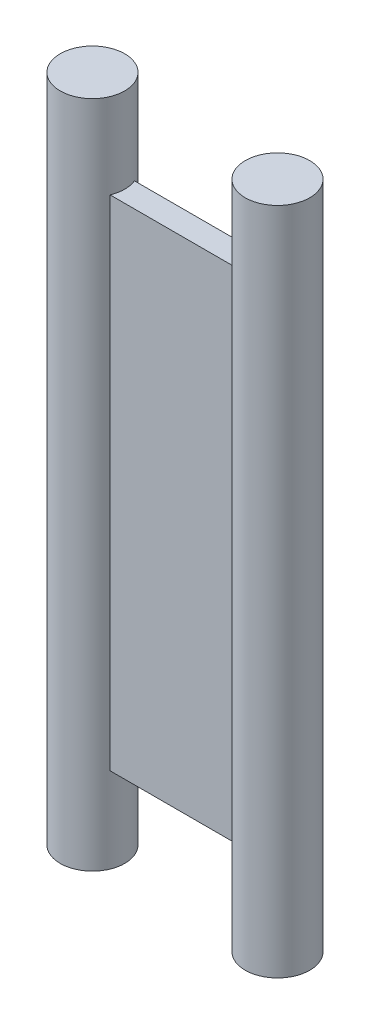
ISO-10303-21;
HEADER;
FILE_DESCRIPTION(('STEP AP214'),'2;1');
FILE_NAME('part.step','',(''),(''),'','','');
FILE_SCHEMA(('AUTOMOTIVE_DESIGN { 1 0 10303 214 1 1 1 1 }'));
ENDSEC;
DATA;
#1=APPLICATION_CONTEXT('core data for automotive mechanical design processes');
#2=APPLICATION_PROTOCOL_DEFINITION('international standard','automotive_design',2000,#1);
#3=PRODUCT_CONTEXT('',#1,'mechanical');
#4=PRODUCT('Part','Part','',(#3));
#5=PRODUCT_RELATED_PRODUCT_CATEGORY('part','',(#4));
#6=PRODUCT_DEFINITION_FORMATION('','',#4);
#7=PRODUCT_DEFINITION_CONTEXT('part definition',#1,'design');
#8=PRODUCT_DEFINITION('design','',#6,#7);
#9=PRODUCT_DEFINITION_SHAPE('','',#8);
#10=(LENGTH_UNIT() NAMED_UNIT(*) SI_UNIT(.MILLI.,.METRE.));
#11=(NAMED_UNIT(*) PLANE_ANGLE_UNIT() SI_UNIT($,.RADIAN.));
#12=(NAMED_UNIT(*) SI_UNIT($,.STERADIAN.) SOLID_ANGLE_UNIT());
#13=UNCERTAINTY_MEASURE_WITH_UNIT(LENGTH_MEASURE(1.E-05),#10,'distance_accuracy_value','');
#14=(GEOMETRIC_REPRESENTATION_CONTEXT(3) GLOBAL_UNCERTAINTY_ASSIGNED_CONTEXT((#13)) GLOBAL_UNIT_ASSIGNED_CONTEXT((#10,
#11,#12)) REPRESENTATION_CONTEXT('',''));
#15=CARTESIAN_POINT('',(0.,0.,0.));
#16=DIRECTION('',(0.,0.,1.));
#17=DIRECTION('',(1.,0.,0.));
#18=AXIS2_PLACEMENT_3D('',#15,#16,#17);
#19=CARTESIAN_POINT('',(3.803,20.5,0.5));
#20=DIRECTION('',(0.,0.,-1.));
#21=DIRECTION('',(-1.,0.,0.));
#22=AXIS2_PLACEMENT_3D('',#19,#20,#21);
#23=PLANE('',#22);
#24=DIRECTION('',(0.,-1.,0.));
#25=VECTOR('',#24,1.);
#26=CARTESIAN_POINT('',(2.5759608808192,24.,0.5));
#27=LINE('',#26,#25);
#28=CARTESIAN_POINT('',(2.5759608808192,20.5,0.5));
#29=VERTEX_POINT('',#28);
#30=CARTESIAN_POINT('',(2.5759608808192,0.,0.499999999999999));
#31=VERTEX_POINT('',#30);
#32=EDGE_CURVE('E53',#29,#31,#27,.T.);
#33=ORIENTED_EDGE('',*,*,#32,.F.);
#34=DIRECTION('',(1.,0.,0.));
#35=VECTOR('',#34,1.);
#36=CARTESIAN_POINT('',(3.803,20.5,0.5));
#37=LINE('',#36,#35);
#38=CARTESIAN_POINT('',(-2.5759608808192,20.5,0.5));
#39=VERTEX_POINT('',#38);
#40=EDGE_CURVE('E90',#39,#29,#37,.T.);
#41=ORIENTED_EDGE('',*,*,#40,.F.);
#42=DIRECTION('',(0.,-1.,0.));
#43=VECTOR('',#42,1.);
#44=CARTESIAN_POINT('',(-2.5759608808192,24.,0.5));
#45=LINE('',#44,#43);
#46=CARTESIAN_POINT('',(-2.5759608808192,0.,0.5));
#47=VERTEX_POINT('',#46);
#48=EDGE_CURVE('E103',#47,#39,#45,.F.);
#49=ORIENTED_EDGE('',*,*,#48,.F.);
#50=DIRECTION('',(1.,0.,0.));
#51=VECTOR('',#50,1.);
#52=CARTESIAN_POINT('',(3.803,0.,0.5));
#53=LINE('',#52,#51);
#54=EDGE_CURVE('E91',#47,#31,#53,.T.);
#55=ORIENTED_EDGE('',*,*,#54,.T.);
#56=EDGE_LOOP('',(#33,#41,#49,#55));
#57=FACE_BOUND('',#56,.T.);
#58=ADVANCED_FACE('F39',(#57),#23,.F.);
#59=CARTESIAN_POINT('',(3.803,20.5,-0.5));
#60=DIRECTION('',(0.,0.,1.));
#61=DIRECTION('',(1.,0.,0.));
#62=AXIS2_PLACEMENT_3D('',#59,#60,#61);
#63=PLANE('',#62);
#64=DIRECTION('',(0.,-1.,0.));
#65=VECTOR('',#64,1.);
#66=CARTESIAN_POINT('',(2.5759608808192,24.,-0.5));
#67=LINE('',#66,#65);
#68=CARTESIAN_POINT('',(2.5759608808192,0.,-0.5));
#69=VERTEX_POINT('',#68);
#70=CARTESIAN_POINT('',(2.5759608808192,20.5,-0.5));
#71=VERTEX_POINT('',#70);
#72=EDGE_CURVE('E78',#69,#71,#67,.F.);
#73=ORIENTED_EDGE('',*,*,#72,.F.);
#74=DIRECTION('',(-1.,0.,0.));
#75=VECTOR('',#74,1.);
#76=CARTESIAN_POINT('',(3.803,0.,-0.5));
#77=LINE('',#76,#75);
#78=CARTESIAN_POINT('',(-2.5759608808192,0.,-0.499999999999999));
#79=VERTEX_POINT('',#78);
#80=EDGE_CURVE('E60',#69,#79,#77,.T.);
#81=ORIENTED_EDGE('',*,*,#80,.T.);
#82=DIRECTION('',(0.,-1.,0.));
#83=VECTOR('',#82,1.);
#84=CARTESIAN_POINT('',(-2.5759608808192,24.,-0.5));
#85=LINE('',#84,#83);
#86=CARTESIAN_POINT('',(-2.5759608808192,20.5,-0.5));
#87=VERTEX_POINT('',#86);
#88=EDGE_CURVE('E105',#87,#79,#85,.T.);
#89=ORIENTED_EDGE('',*,*,#88,.F.);
#90=DIRECTION('',(-1.,0.,0.));
#91=VECTOR('',#90,1.);
#92=CARTESIAN_POINT('',(3.803,20.5,-0.5));
#93=LINE('',#92,#91);
#94=EDGE_CURVE('E85',#71,#87,#93,.T.);
#95=ORIENTED_EDGE('',*,*,#94,.F.);
#96=EDGE_LOOP('',(#73,#81,#89,#95));
#97=FACE_BOUND('',#96,.T.);
#98=ADVANCED_FACE('F84',(#97),#63,.F.);
#99=CARTESIAN_POINT('',(-3.803,24.,0.));
#100=DIRECTION('',(0.,-1.,0.));
#101=DIRECTION('',(0.,0.,-1.));
#102=AXIS2_PLACEMENT_3D('',#99,#100,#101);
#103=CYLINDRICAL_SURFACE('',#102,1.325);
#104=CARTESIAN_POINT('',(-3.803,24.,0.));
#105=DIRECTION('',(0.,1.,0.));
#106=DIRECTION('',(0.,0.,1.));
#107=AXIS2_PLACEMENT_3D('',#104,#105,#106);
#108=CIRCLE('',#107,1.325);
#109=CARTESIAN_POINT('',(-3.803,24.,1.325));
#110=VERTEX_POINT('',#109);
#111=EDGE_CURVE('E107',#110,#110,#108,.T.);
#112=ORIENTED_EDGE('',*,*,#111,.F.);
#113=EDGE_LOOP('',(#112));
#114=FACE_BOUND('',#113,.T.);
#115=CARTESIAN_POINT('',(-3.803,-3.5,0.));
#116=DIRECTION('',(0.,1.,0.));
#117=DIRECTION('',(0.,0.,1.));
#118=AXIS2_PLACEMENT_3D('',#115,#116,#117);
#119=CIRCLE('',#118,1.325);
#120=CARTESIAN_POINT('',(-3.803,-3.5,1.325));
#121=VERTEX_POINT('',#120);
#122=EDGE_CURVE('E108',#121,#121,#119,.T.);
#123=ORIENTED_EDGE('',*,*,#122,.T.);
#124=EDGE_LOOP('',(#123));
#125=FACE_BOUND('',#124,.T.);
#126=ORIENTED_EDGE('',*,*,#48,.T.);
#127=CARTESIAN_POINT('',(-3.803,20.5,0.));
#128=DIRECTION('',(0.,-1.,0.));
#129=DIRECTION('',(0.,0.,-1.));
#130=AXIS2_PLACEMENT_3D('',#127,#128,#129);
#131=CIRCLE('',#130,1.325);
#132=EDGE_CURVE('E95',#39,#87,#131,.F.);
#133=ORIENTED_EDGE('',*,*,#132,.T.);
#134=ORIENTED_EDGE('',*,*,#88,.T.);
#135=CARTESIAN_POINT('',(-3.803,0.,0.));
#136=DIRECTION('',(0.,-1.,0.));
#137=DIRECTION('',(0.,0.,-1.));
#138=AXIS2_PLACEMENT_3D('',#135,#136,#137);
#139=CIRCLE('',#138,1.325);
#140=EDGE_CURVE('E46',#47,#79,#139,.F.);
#141=ORIENTED_EDGE('',*,*,#140,.F.);
#142=EDGE_LOOP('',(#126,#133,#134,#141));
#143=FACE_BOUND('',#142,.T.);
#144=ADVANCED_FACE('F138',(#114,#125,#143),#103,.T.);
#145=CARTESIAN_POINT('',(-3.803,24.,0.));
#146=DIRECTION('',(0.,1.,0.));
#147=DIRECTION('',(0.,0.,1.));
#148=AXIS2_PLACEMENT_3D('',#145,#146,#147);
#149=PLANE('',#148);
#150=ORIENTED_EDGE('',*,*,#111,.T.);
#151=EDGE_LOOP('',(#150));
#152=FACE_BOUND('',#151,.T.);
#153=ADVANCED_FACE('F144',(#152),#149,.T.);
#154=CARTESIAN_POINT('',(-3.803,-3.5,0.));
#155=DIRECTION('',(0.,1.,0.));
#156=DIRECTION('',(0.,0.,1.));
#157=AXIS2_PLACEMENT_3D('',#154,#155,#156);
#158=PLANE('',#157);
#159=ORIENTED_EDGE('',*,*,#122,.F.);
#160=EDGE_LOOP('',(#159));
#161=FACE_BOUND('',#160,.T.);
#162=ADVANCED_FACE('F150',(#161),#158,.F.);
#163=CARTESIAN_POINT('',(0.,20.5,0.));
#164=DIRECTION('',(0.,-1.,0.));
#165=DIRECTION('',(0.,0.,-1.));
#166=AXIS2_PLACEMENT_3D('',#163,#164,#165);
#167=PLANE('',#166);
#168=CARTESIAN_POINT('',(3.803,20.5,0.));
#169=DIRECTION('',(0.,-1.,0.));
#170=DIRECTION('',(0.,0.,-1.));
#171=AXIS2_PLACEMENT_3D('',#168,#169,#170);
#172=CIRCLE('',#171,1.325);
#173=EDGE_CURVE('E111',#71,#29,#172,.F.);
#174=ORIENTED_EDGE('',*,*,#173,.F.);
#175=ORIENTED_EDGE('',*,*,#94,.T.);
#176=ORIENTED_EDGE('',*,*,#132,.F.);
#177=ORIENTED_EDGE('',*,*,#40,.T.);
#178=EDGE_LOOP('',(#174,#175,#176,#177));
#179=FACE_BOUND('',#178,.T.);
#180=ADVANCED_FACE('F141',(#179),#167,.F.);
#181=CARTESIAN_POINT('',(0.,0.,0.));
#182=DIRECTION('',(0.,-1.,0.));
#183=DIRECTION('',(0.,0.,-1.));
#184=AXIS2_PLACEMENT_3D('',#181,#182,#183);
#185=PLANE('',#184);
#186=ORIENTED_EDGE('',*,*,#80,.F.);
#187=CARTESIAN_POINT('',(3.803,0.,0.));
#188=DIRECTION('',(0.,-1.,0.));
#189=DIRECTION('',(0.,0.,-1.));
#190=AXIS2_PLACEMENT_3D('',#187,#188,#189);
#191=CIRCLE('',#190,1.325);
#192=EDGE_CURVE('E11',#69,#31,#191,.F.);
#193=ORIENTED_EDGE('',*,*,#192,.T.);
#194=ORIENTED_EDGE('',*,*,#54,.F.);
#195=ORIENTED_EDGE('',*,*,#140,.T.);
#196=EDGE_LOOP('',(#186,#193,#194,#195));
#197=FACE_BOUND('',#196,.T.);
#198=ADVANCED_FACE('F89',(#197),#185,.T.);
#199=CARTESIAN_POINT('',(3.803,24.,0.));
#200=DIRECTION('',(0.,-1.,0.));
#201=DIRECTION('',(0.,0.,-1.));
#202=AXIS2_PLACEMENT_3D('',#199,#200,#201);
#203=CYLINDRICAL_SURFACE('',#202,1.325);
#204=CARTESIAN_POINT('',(3.803,24.,0.));
#205=DIRECTION('',(0.,1.,0.));
#206=DIRECTION('',(0.,0.,1.));
#207=AXIS2_PLACEMENT_3D('',#204,#205,#206);
#208=CIRCLE('',#207,1.325);
#209=CARTESIAN_POINT('',(3.803,24.,1.325));
#210=VERTEX_POINT('',#209);
#211=EDGE_CURVE('E116',#210,#210,#208,.T.);
#212=ORIENTED_EDGE('',*,*,#211,.F.);
#213=EDGE_LOOP('',(#212));
#214=FACE_BOUND('',#213,.T.);
#215=CARTESIAN_POINT('',(3.803,-3.5,0.));
#216=DIRECTION('',(0.,1.,0.));
#217=DIRECTION('',(0.,0.,1.));
#218=AXIS2_PLACEMENT_3D('',#215,#216,#217);
#219=CIRCLE('',#218,1.325);
#220=CARTESIAN_POINT('',(3.803,-3.5,1.325));
#221=VERTEX_POINT('',#220);
#222=EDGE_CURVE('E86',#221,#221,#219,.T.);
#223=ORIENTED_EDGE('',*,*,#222,.T.);
#224=EDGE_LOOP('',(#223));
#225=FACE_BOUND('',#224,.T.);
#226=ORIENTED_EDGE('',*,*,#72,.T.);
#227=ORIENTED_EDGE('',*,*,#173,.T.);
#228=ORIENTED_EDGE('',*,*,#32,.T.);
#229=ORIENTED_EDGE('',*,*,#192,.F.);
#230=EDGE_LOOP('',(#226,#227,#228,#229));
#231=FACE_BOUND('',#230,.T.);
#232=ADVANCED_FACE('F77',(#214,#225,#231),#203,.T.);
#233=CARTESIAN_POINT('',(3.803,24.,0.));
#234=DIRECTION('',(0.,1.,0.));
#235=DIRECTION('',(0.,0.,1.));
#236=AXIS2_PLACEMENT_3D('',#233,#234,#235);
#237=PLANE('',#236);
#238=ORIENTED_EDGE('',*,*,#211,.T.);
#239=EDGE_LOOP('',(#238));
#240=FACE_BOUND('',#239,.T.);
#241=ADVANCED_FACE('F125',(#240),#237,.T.);
#242=CARTESIAN_POINT('',(3.803,-3.5,0.));
#243=DIRECTION('',(0.,1.,0.));
#244=DIRECTION('',(0.,0.,1.));
#245=AXIS2_PLACEMENT_3D('',#242,#243,#244);
#246=PLANE('',#245);
#247=ORIENTED_EDGE('',*,*,#222,.F.);
#248=EDGE_LOOP('',(#247));
#249=FACE_BOUND('',#248,.T.);
#250=ADVANCED_FACE('F123',(#249),#246,.F.);
#251=CLOSED_SHELL('',(#58,#98,#144,#153,#162,#180,#198,#232,#241,#250));
#252=MANIFOLD_SOLID_BREP('B2',#251);
#253=ADVANCED_BREP_SHAPE_REPRESENTATION('',(#18,#252),#14);
#254=SHAPE_DEFINITION_REPRESENTATION(#9,#253);
ENDSEC;
END-ISO-10303-21;
